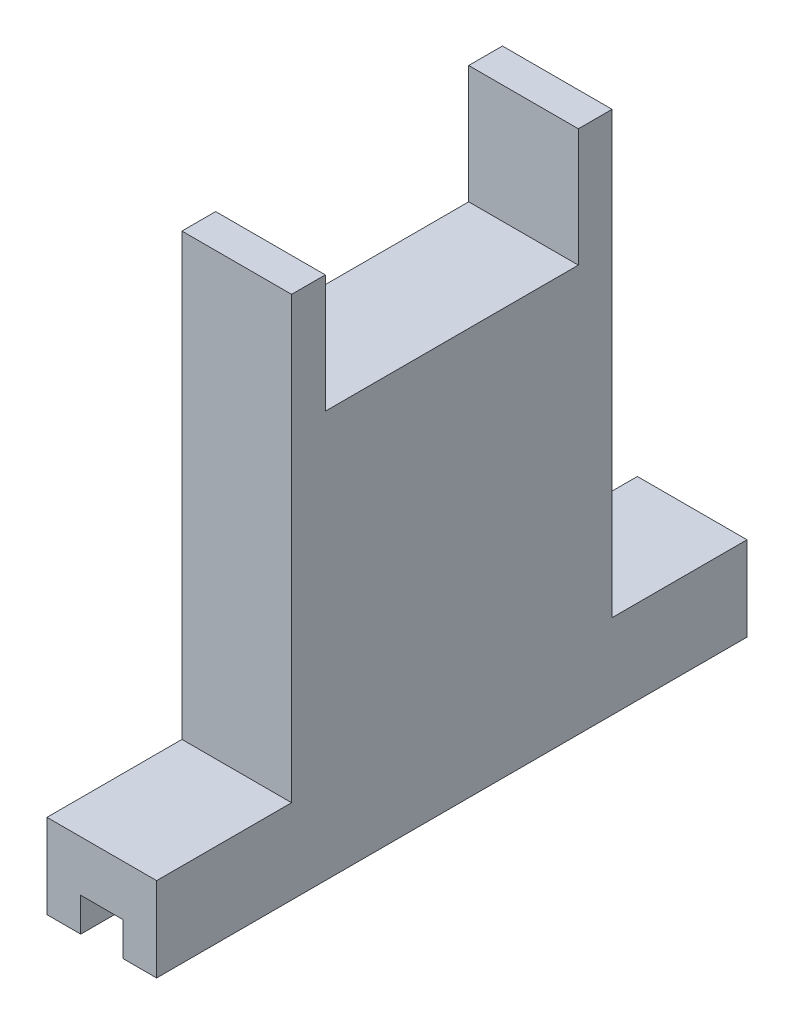
ISO-10303-21;
HEADER;
FILE_DESCRIPTION(('STEP AP214'),'2;1');
FILE_NAME('part.step','',(''),(''),'','','');
FILE_SCHEMA(('AUTOMOTIVE_DESIGN { 1 0 10303 214 1 1 1 1 }'));
ENDSEC;
DATA;
#1=APPLICATION_CONTEXT('core data for automotive mechanical design processes');
#2=APPLICATION_PROTOCOL_DEFINITION('international standard','automotive_design',2000,#1);
#3=PRODUCT_CONTEXT('',#1,'mechanical');
#4=PRODUCT('Part','Part','',(#3));
#5=PRODUCT_RELATED_PRODUCT_CATEGORY('part','',(#4));
#6=PRODUCT_DEFINITION_FORMATION('','',#4);
#7=PRODUCT_DEFINITION_CONTEXT('part definition',#1,'design');
#8=PRODUCT_DEFINITION('design','',#6,#7);
#9=PRODUCT_DEFINITION_SHAPE('','',#8);
#10=(LENGTH_UNIT() NAMED_UNIT(*) SI_UNIT(.MILLI.,.METRE.));
#11=(NAMED_UNIT(*) PLANE_ANGLE_UNIT() SI_UNIT($,.RADIAN.));
#12=(NAMED_UNIT(*) SI_UNIT($,.STERADIAN.) SOLID_ANGLE_UNIT());
#13=UNCERTAINTY_MEASURE_WITH_UNIT(LENGTH_MEASURE(1.E-05),#10,'distance_accuracy_value','');
#14=(GEOMETRIC_REPRESENTATION_CONTEXT(3) GLOBAL_UNCERTAINTY_ASSIGNED_CONTEXT((#13)) GLOBAL_UNIT_ASSIGNED_CONTEXT((#10,
#11,#12)) REPRESENTATION_CONTEXT('',''));
#15=CARTESIAN_POINT('',(0.,0.,0.));
#16=DIRECTION('',(0.,0.,1.));
#17=DIRECTION('',(1.,0.,0.));
#18=AXIS2_PLACEMENT_3D('',#15,#16,#17);
#19=CARTESIAN_POINT('',(0.,31.1,0.));
#20=DIRECTION('',(0.,1.,0.));
#21=DIRECTION('',(0.,0.,1.));
#22=AXIS2_PLACEMENT_3D('',#19,#20,#21);
#23=PLANE('',#22);
#24=DIRECTION('',(1.,0.,0.));
#25=VECTOR('',#24,1.);
#26=CARTESIAN_POINT('',(-83.4178979164732,31.1,-14.0159846434839));
#27=LINE('',#26,#25);
#28=CARTESIAN_POINT('',(-89.9178979164732,31.1,-14.0159846434839));
#29=VERTEX_POINT('',#28);
#30=CARTESIAN_POINT('',(-83.4178979164732,31.1,-14.0159846434839));
#31=VERTEX_POINT('',#30);
#32=EDGE_CURVE('E163',#29,#31,#27,.T.);
#33=ORIENTED_EDGE('',*,*,#32,.F.);
#34=DIRECTION('',(0.,0.,1.));
#35=VECTOR('',#34,1.);
#36=CARTESIAN_POINT('',(-89.9178979164732,31.1,-31.0159846434839));
#37=LINE('',#36,#35);
#38=CARTESIAN_POINT('',(-89.9178979164732,31.1,-12.0159846434839));
#39=VERTEX_POINT('',#38);
#40=EDGE_CURVE('E179',#29,#39,#37,.T.);
#41=ORIENTED_EDGE('',*,*,#40,.T.);
#42=DIRECTION('',(1.,0.,0.));
#43=VECTOR('',#42,1.);
#44=CARTESIAN_POINT('',(-89.9178979164732,31.1,-12.0159846434839));
#45=LINE('',#44,#43);
#46=CARTESIAN_POINT('',(-83.4178979164732,31.1,-12.0159846434839));
#47=VERTEX_POINT('',#46);
#48=EDGE_CURVE('E178',#39,#47,#45,.T.);
#49=ORIENTED_EDGE('',*,*,#48,.T.);
#50=DIRECTION('',(0.,0.,-1.));
#51=VECTOR('',#50,1.);
#52=CARTESIAN_POINT('',(-83.4178979164732,31.1,-31.0159846434839));
#53=LINE('',#52,#51);
#54=EDGE_CURVE('E181',#47,#31,#53,.T.);
#55=ORIENTED_EDGE('',*,*,#54,.T.);
#56=EDGE_LOOP('',(#33,#41,#49,#55));
#57=FACE_BOUND('',#56,.T.);
#58=ADVANCED_FACE('F35',(#57),#23,.T.);
#59=CARTESIAN_POINT('',(0.,5.,0.));
#60=DIRECTION('',(0.,1.,0.));
#61=DIRECTION('',(0.,0.,1.));
#62=AXIS2_PLACEMENT_3D('',#59,#60,#61);
#63=PLANE('',#62);
#64=DIRECTION('',(-1.,0.,0.));
#65=VECTOR('',#64,1.);
#66=CARTESIAN_POINT('',(-89.9178979164732,5.,-31.0159846434839));
#67=LINE('',#66,#65);
#68=CARTESIAN_POINT('',(-83.4178979164732,5.,-31.0159846434839));
#69=VERTEX_POINT('',#68);
#70=CARTESIAN_POINT('',(-89.9178979164732,5.,-31.0159846434839));
#71=VERTEX_POINT('',#70);
#72=EDGE_CURVE('E58',#69,#71,#67,.T.);
#73=ORIENTED_EDGE('',*,*,#72,.F.);
#74=DIRECTION('',(0.,0.,-1.));
#75=VECTOR('',#74,1.);
#76=CARTESIAN_POINT('',(-83.4178979164732,5.,-39.0159846434839));
#77=LINE('',#76,#75);
#78=CARTESIAN_POINT('',(-83.4178979164732,5.,-39.0159846434839));
#79=VERTEX_POINT('',#78);
#80=EDGE_CURVE('E227',#69,#79,#77,.T.);
#81=ORIENTED_EDGE('',*,*,#80,.T.);
#82=DIRECTION('',(-1.,0.,0.));
#83=VECTOR('',#82,1.);
#84=CARTESIAN_POINT('',(-89.9178979164732,5.,-39.0159846434839));
#85=LINE('',#84,#83);
#86=CARTESIAN_POINT('',(-89.9178979164732,5.,-39.0159846434839));
#87=VERTEX_POINT('',#86);
#88=EDGE_CURVE('E230',#79,#87,#85,.T.);
#89=ORIENTED_EDGE('',*,*,#88,.T.);
#90=DIRECTION('',(0.,0.,1.));
#91=VECTOR('',#90,1.);
#92=CARTESIAN_POINT('',(-89.9178979164732,5.,-39.0159846434839));
#93=LINE('',#92,#91);
#94=EDGE_CURVE('E222',#87,#71,#93,.T.);
#95=ORIENTED_EDGE('',*,*,#94,.T.);
#96=EDGE_LOOP('',(#73,#81,#89,#95));
#97=FACE_BOUND('',#96,.T.);
#98=ADVANCED_FACE('F295',(#97),#63,.T.);
#99=CARTESIAN_POINT('',(0.,0.,0.));
#100=DIRECTION('',(0.,1.,0.));
#101=DIRECTION('',(0.,0.,1.));
#102=AXIS2_PLACEMENT_3D('',#99,#100,#101);
#103=PLANE('',#102);
#104=DIRECTION('',(1.,0.,0.));
#105=VECTOR('',#104,1.);
#106=CARTESIAN_POINT('',(-89.9178979164732,0.,-4.01598464348394));
#107=LINE('',#106,#105);
#108=CARTESIAN_POINT('',(-85.4178979164732,0.,-4.01598464348394));
#109=VERTEX_POINT('',#108);
#110=CARTESIAN_POINT('',(-83.4178979164732,0.,-4.01598464348394));
#111=VERTEX_POINT('',#110);
#112=EDGE_CURVE('E235',#109,#111,#107,.T.);
#113=ORIENTED_EDGE('',*,*,#112,.F.);
#114=DIRECTION('',(0.,0.,-1.));
#115=VECTOR('',#114,1.);
#116=CARTESIAN_POINT('',(-85.4178979164732,0.,0.));
#117=LINE('',#116,#115);
#118=CARTESIAN_POINT('',(-85.4178979164732,0.,-39.0159846434839));
#119=VERTEX_POINT('',#118);
#120=EDGE_CURVE('E43',#109,#119,#117,.T.);
#121=ORIENTED_EDGE('',*,*,#120,.T.);
#122=DIRECTION('',(-1.,0.,0.));
#123=VECTOR('',#122,1.);
#124=CARTESIAN_POINT('',(-89.9178979164732,0.,-39.0159846434839));
#125=LINE('',#124,#123);
#126=CARTESIAN_POINT('',(-83.4178979164732,0.,-39.0159846434839));
#127=VERTEX_POINT('',#126);
#128=EDGE_CURVE('E242',#127,#119,#125,.T.);
#129=ORIENTED_EDGE('',*,*,#128,.F.);
#130=DIRECTION('',(0.,0.,-1.));
#131=VECTOR('',#130,1.);
#132=CARTESIAN_POINT('',(-83.4178979164732,0.,-39.0159846434839));
#133=LINE('',#132,#131);
#134=EDGE_CURVE('E239',#111,#127,#133,.T.);
#135=ORIENTED_EDGE('',*,*,#134,.F.);
#136=EDGE_LOOP('',(#113,#121,#129,#135));
#137=FACE_BOUND('',#136,.T.);
#138=ADVANCED_FACE('F262',(#137),#103,.F.);
#139=CARTESIAN_POINT('',(-89.9178979164732,5.,-39.0159846434839));
#140=DIRECTION('',(1.,0.,0.));
#141=DIRECTION('',(0.,0.,-1.));
#142=AXIS2_PLACEMENT_3D('',#139,#140,#141);
#143=PLANE('',#142);
#144=ORIENTED_EDGE('',*,*,#40,.F.);
#145=DIRECTION('',(0.,1.,0.));
#146=VECTOR('',#145,1.);
#147=CARTESIAN_POINT('',(-89.9178979164732,24.1,-14.0159846434839));
#148=LINE('',#147,#146);
#149=CARTESIAN_POINT('',(-89.9178979164732,24.1,-14.0159846434839));
#150=VERTEX_POINT('',#149);
#151=EDGE_CURVE('E170',#150,#29,#148,.T.);
#152=ORIENTED_EDGE('',*,*,#151,.F.);
#153=DIRECTION('',(0.,0.,1.));
#154=VECTOR('',#153,1.);
#155=CARTESIAN_POINT('',(-89.9178979164732,24.1,-29.0159846434839));
#156=LINE('',#155,#154);
#157=CARTESIAN_POINT('',(-89.9178979164732,24.1,-29.0159846434839));
#158=VERTEX_POINT('',#157);
#159=EDGE_CURVE('E153',#158,#150,#156,.T.);
#160=ORIENTED_EDGE('',*,*,#159,.F.);
#161=DIRECTION('',(0.,1.,0.));
#162=VECTOR('',#161,1.);
#163=CARTESIAN_POINT('',(-89.9178979164732,24.1,-29.0159846434839));
#164=LINE('',#163,#162);
#165=CARTESIAN_POINT('',(-89.9178979164732,31.1,-29.0159846434839));
#166=VERTEX_POINT('',#165);
#167=EDGE_CURVE('E150',#158,#166,#164,.T.);
#168=ORIENTED_EDGE('',*,*,#167,.T.);
#169=CARTESIAN_POINT('',(-89.9178979164732,31.1,-31.0159846434839));
#170=VERTEX_POINT('',#169);
#171=EDGE_CURVE('E175',#170,#166,#37,.T.);
#172=ORIENTED_EDGE('',*,*,#171,.F.);
#173=DIRECTION('',(0.,-1.,0.));
#174=VECTOR('',#173,1.);
#175=CARTESIAN_POINT('',(-89.9178979164732,31.1,-31.0159846434839));
#176=LINE('',#175,#174);
#177=EDGE_CURVE('E186',#170,#71,#176,.T.);
#178=ORIENTED_EDGE('',*,*,#177,.T.);
#179=ORIENTED_EDGE('',*,*,#94,.F.);
#180=DIRECTION('',(0.,-1.,0.));
#181=VECTOR('',#180,1.);
#182=CARTESIAN_POINT('',(-89.9178979164732,5.,-39.0159846434839));
#183=LINE('',#182,#181);
#184=CARTESIAN_POINT('',(-89.9178979164732,0.,-39.0159846434839));
#185=VERTEX_POINT('',#184);
#186=EDGE_CURVE('E232',#87,#185,#183,.T.);
#187=ORIENTED_EDGE('',*,*,#186,.T.);
#188=DIRECTION('',(0.,0.,1.));
#189=VECTOR('',#188,1.);
#190=CARTESIAN_POINT('',(-89.9178979164732,0.,-39.0159846434839));
#191=LINE('',#190,#189);
#192=CARTESIAN_POINT('',(-89.9178979164732,0.,-4.01598464348394));
#193=VERTEX_POINT('',#192);
#194=EDGE_CURVE('E221',#185,#193,#191,.T.);
#195=ORIENTED_EDGE('',*,*,#194,.T.);
#196=DIRECTION('',(0.,-1.,0.));
#197=VECTOR('',#196,1.);
#198=CARTESIAN_POINT('',(-89.9178979164732,5.,-4.01598464348394));
#199=LINE('',#198,#197);
#200=CARTESIAN_POINT('',(-89.9178979164732,5.,-4.01598464348394));
#201=VERTEX_POINT('',#200);
#202=EDGE_CURVE('E253',#201,#193,#199,.T.);
#203=ORIENTED_EDGE('',*,*,#202,.F.);
#204=CARTESIAN_POINT('',(-89.9178979164732,5.,-12.0159846434839));
#205=VERTEX_POINT('',#204);
#206=EDGE_CURVE('E225',#205,#201,#93,.T.);
#207=ORIENTED_EDGE('',*,*,#206,.F.);
#208=DIRECTION('',(0.,-1.,0.));
#209=VECTOR('',#208,1.);
#210=CARTESIAN_POINT('',(-89.9178979164732,31.1,-12.0159846434839));
#211=LINE('',#210,#209);
#212=EDGE_CURVE('E200',#39,#205,#211,.T.);
#213=ORIENTED_EDGE('',*,*,#212,.F.);
#214=EDGE_LOOP('',(#144,#152,#160,#168,#172,#178,#179,#187,#195,#203,#207,#213));
#215=FACE_BOUND('',#214,.T.);
#216=ADVANCED_FACE('F37',(#215),#143,.F.);
#217=CARTESIAN_POINT('',(-89.9178979164732,5.,-4.01598464348394));
#218=DIRECTION('',(0.,0.,-1.));
#219=DIRECTION('',(-1.,0.,0.));
#220=AXIS2_PLACEMENT_3D('',#217,#218,#219);
#221=PLANE('',#220);
#222=DIRECTION('',(-1.,0.,0.));
#223=VECTOR('',#222,1.);
#224=CARTESIAN_POINT('',(-85.4178979164732,2.,-4.01598464348394));
#225=LINE('',#224,#223);
#226=CARTESIAN_POINT('',(-85.4178979164732,2.,-4.01598464348394));
#227=VERTEX_POINT('',#226);
#228=CARTESIAN_POINT('',(-87.9178979164732,2.,-4.01598464348394));
#229=VERTEX_POINT('',#228);
#230=EDGE_CURVE('E206',#227,#229,#225,.T.);
#231=ORIENTED_EDGE('',*,*,#230,.F.);
#232=DIRECTION('',(0.,1.,0.));
#233=VECTOR('',#232,1.);
#234=CARTESIAN_POINT('',(-85.4178979164732,0.,-4.01598464348394));
#235=LINE('',#234,#233);
#236=EDGE_CURVE('E203',#109,#227,#235,.T.);
#237=ORIENTED_EDGE('',*,*,#236,.F.);
#238=ORIENTED_EDGE('',*,*,#112,.T.);
#239=DIRECTION('',(0.,-1.,0.));
#240=VECTOR('',#239,1.);
#241=CARTESIAN_POINT('',(-83.4178979164732,5.,-4.01598464348394));
#242=LINE('',#241,#240);
#243=CARTESIAN_POINT('',(-83.4178979164732,5.,-4.01598464348394));
#244=VERTEX_POINT('',#243);
#245=EDGE_CURVE('E250',#244,#111,#242,.T.);
#246=ORIENTED_EDGE('',*,*,#245,.F.);
#247=DIRECTION('',(1.,0.,0.));
#248=VECTOR('',#247,1.);
#249=CARTESIAN_POINT('',(-89.9178979164732,5.,-4.01598464348394));
#250=LINE('',#249,#248);
#251=EDGE_CURVE('E224',#201,#244,#250,.T.);
#252=ORIENTED_EDGE('',*,*,#251,.F.);
#253=ORIENTED_EDGE('',*,*,#202,.T.);
#254=CARTESIAN_POINT('',(-87.9178979164732,0.,-4.01598464348394));
#255=VERTEX_POINT('',#254);
#256=EDGE_CURVE('E236',#193,#255,#107,.T.);
#257=ORIENTED_EDGE('',*,*,#256,.T.);
#258=DIRECTION('',(0.,-1.,0.));
#259=VECTOR('',#258,1.);
#260=CARTESIAN_POINT('',(-87.9178979164732,0.,-4.01598464348394));
#261=LINE('',#260,#259);
#262=EDGE_CURVE('E209',#229,#255,#261,.T.);
#263=ORIENTED_EDGE('',*,*,#262,.F.);
#264=EDGE_LOOP('',(#231,#237,#238,#246,#252,#253,#257,#263));
#265=FACE_BOUND('',#264,.T.);
#266=ADVANCED_FACE('F276',(#265),#221,.F.);
#267=CARTESIAN_POINT('',(-83.4178979164732,5.,-39.0159846434839));
#268=DIRECTION('',(-1.,0.,0.));
#269=DIRECTION('',(0.,0.,1.));
#270=AXIS2_PLACEMENT_3D('',#267,#268,#269);
#271=PLANE('',#270);
#272=DIRECTION('',(0.,0.,-1.));
#273=VECTOR('',#272,1.);
#274=CARTESIAN_POINT('',(-83.4178979164732,24.1,-29.0159846434839));
#275=LINE('',#274,#273);
#276=CARTESIAN_POINT('',(-83.4178979164732,24.1,-14.0159846434839));
#277=VERTEX_POINT('',#276);
#278=CARTESIAN_POINT('',(-83.4178979164732,24.1,-29.0159846434839));
#279=VERTEX_POINT('',#278);
#280=EDGE_CURVE('E154',#277,#279,#275,.T.);
#281=ORIENTED_EDGE('',*,*,#280,.F.);
#282=DIRECTION('',(0.,1.,0.));
#283=VECTOR('',#282,1.);
#284=CARTESIAN_POINT('',(-83.4178979164732,24.1,-14.0159846434839));
#285=LINE('',#284,#283);
#286=EDGE_CURVE('E190',#277,#31,#285,.T.);
#287=ORIENTED_EDGE('',*,*,#286,.T.);
#288=ORIENTED_EDGE('',*,*,#54,.F.);
#289=DIRECTION('',(0.,-1.,0.));
#290=VECTOR('',#289,1.);
#291=CARTESIAN_POINT('',(-83.4178979164732,31.1,-12.0159846434839));
#292=LINE('',#291,#290);
#293=CARTESIAN_POINT('',(-83.4178979164732,5.,-12.0159846434839));
#294=VERTEX_POINT('',#293);
#295=EDGE_CURVE('E197',#47,#294,#292,.T.);
#296=ORIENTED_EDGE('',*,*,#295,.T.);
#297=EDGE_CURVE('E228',#244,#294,#77,.T.);
#298=ORIENTED_EDGE('',*,*,#297,.F.);
#299=ORIENTED_EDGE('',*,*,#245,.T.);
#300=ORIENTED_EDGE('',*,*,#134,.T.);
#301=DIRECTION('',(0.,-1.,0.));
#302=VECTOR('',#301,1.);
#303=CARTESIAN_POINT('',(-83.4178979164732,5.,-39.0159846434839));
#304=LINE('',#303,#302);
#305=EDGE_CURVE('E247',#79,#127,#304,.T.);
#306=ORIENTED_EDGE('',*,*,#305,.F.);
#307=ORIENTED_EDGE('',*,*,#80,.F.);
#308=DIRECTION('',(0.,-1.,0.));
#309=VECTOR('',#308,1.);
#310=CARTESIAN_POINT('',(-83.4178979164732,31.1,-31.0159846434839));
#311=LINE('',#310,#309);
#312=CARTESIAN_POINT('',(-83.4178979164732,31.1,-31.0159846434839));
#313=VERTEX_POINT('',#312);
#314=EDGE_CURVE('E194',#313,#69,#311,.T.);
#315=ORIENTED_EDGE('',*,*,#314,.F.);
#316=CARTESIAN_POINT('',(-83.4178979164732,31.1,-29.0159846434839));
#317=VERTEX_POINT('',#316);
#318=EDGE_CURVE('E168',#317,#313,#53,.T.);
#319=ORIENTED_EDGE('',*,*,#318,.F.);
#320=DIRECTION('',(0.,1.,0.));
#321=VECTOR('',#320,1.);
#322=CARTESIAN_POINT('',(-83.4178979164732,24.1,-29.0159846434839));
#323=LINE('',#322,#321);
#324=EDGE_CURVE('E50',#279,#317,#323,.T.);
#325=ORIENTED_EDGE('',*,*,#324,.F.);
#326=EDGE_LOOP('',(#281,#287,#288,#296,#298,#299,#300,#306,#307,#315,#319,#325));
#327=FACE_BOUND('',#326,.T.);
#328=ADVANCED_FACE('F166',(#327),#271,.F.);
#329=CARTESIAN_POINT('',(-89.9178979164732,5.,-39.0159846434839));
#330=DIRECTION('',(0.,0.,1.));
#331=DIRECTION('',(1.,0.,0.));
#332=AXIS2_PLACEMENT_3D('',#329,#330,#331);
#333=PLANE('',#332);
#334=ORIENTED_EDGE('',*,*,#128,.T.);
#335=DIRECTION('',(0.,1.,0.));
#336=VECTOR('',#335,1.);
#337=CARTESIAN_POINT('',(-85.4178979164732,5.,-39.0159846434839));
#338=LINE('',#337,#336);
#339=CARTESIAN_POINT('',(-85.4178979164732,2.,-39.0159846434839));
#340=VERTEX_POINT('',#339);
#341=EDGE_CURVE('E218',#119,#340,#338,.T.);
#342=ORIENTED_EDGE('',*,*,#341,.T.);
#343=DIRECTION('',(-1.,0.,0.));
#344=VECTOR('',#343,1.);
#345=CARTESIAN_POINT('',(-89.9178979164732,2.,-39.0159846434839));
#346=LINE('',#345,#344);
#347=CARTESIAN_POINT('',(-87.9178979164732,2.,-39.0159846434839));
#348=VERTEX_POINT('',#347);
#349=EDGE_CURVE('E11',#340,#348,#346,.T.);
#350=ORIENTED_EDGE('',*,*,#349,.T.);
#351=DIRECTION('',(0.,-1.,0.));
#352=VECTOR('',#351,1.);
#353=CARTESIAN_POINT('',(-87.9178979164732,5.,-39.0159846434839));
#354=LINE('',#353,#352);
#355=CARTESIAN_POINT('',(-87.9178979164732,0.,-39.0159846434839));
#356=VERTEX_POINT('',#355);
#357=EDGE_CURVE('E214',#348,#356,#354,.T.);
#358=ORIENTED_EDGE('',*,*,#357,.T.);
#359=EDGE_CURVE('E241',#356,#185,#125,.T.);
#360=ORIENTED_EDGE('',*,*,#359,.T.);
#361=ORIENTED_EDGE('',*,*,#186,.F.);
#362=ORIENTED_EDGE('',*,*,#88,.F.);
#363=ORIENTED_EDGE('',*,*,#305,.T.);
#364=EDGE_LOOP('',(#334,#342,#350,#358,#360,#361,#362,#363));
#365=FACE_BOUND('',#364,.T.);
#366=ADVANCED_FACE('F267',(#365),#333,.F.);
#367=DIRECTION('',(1.,0.,0.));
#368=VECTOR('',#367,1.);
#369=CARTESIAN_POINT('',(-89.9178979164732,5.,-12.0159846434839));
#370=LINE('',#369,#368);
#371=EDGE_CURVE('E187',#205,#294,#370,.T.);
#372=ORIENTED_EDGE('',*,*,#371,.F.);
#373=ORIENTED_EDGE('',*,*,#206,.T.);
#374=ORIENTED_EDGE('',*,*,#251,.T.);
#375=ORIENTED_EDGE('',*,*,#297,.T.);
#376=EDGE_LOOP('',(#372,#373,#374,#375));
#377=FACE_BOUND('',#376,.T.);
#378=ADVANCED_FACE('F318',(#377),#63,.T.);
#379=ORIENTED_EDGE('',*,*,#359,.F.);
#380=DIRECTION('',(0.,0.,1.));
#381=VECTOR('',#380,1.);
#382=CARTESIAN_POINT('',(-87.9178979164732,0.,0.));
#383=LINE('',#382,#381);
#384=EDGE_CURVE('E256',#356,#255,#383,.T.);
#385=ORIENTED_EDGE('',*,*,#384,.T.);
#386=ORIENTED_EDGE('',*,*,#256,.F.);
#387=ORIENTED_EDGE('',*,*,#194,.F.);
#388=EDGE_LOOP('',(#379,#385,#386,#387));
#389=FACE_BOUND('',#388,.T.);
#390=ADVANCED_FACE('F288',(#389),#103,.F.);
#391=CARTESIAN_POINT('',(-85.4178979164732,2.,-184.015984643484));
#392=DIRECTION('',(0.,1.,0.));
#393=DIRECTION('',(-1.,0.,0.));
#394=AXIS2_PLACEMENT_3D('',#391,#392,#393);
#395=PLANE('',#394);
#396=DIRECTION('',(0.,0.,1.));
#397=VECTOR('',#396,1.);
#398=CARTESIAN_POINT('',(-85.4178979164732,2.,-184.015984643484));
#399=LINE('',#398,#397);
#400=EDGE_CURVE('E211',#340,#227,#399,.T.);
#401=ORIENTED_EDGE('',*,*,#400,.T.);
#402=ORIENTED_EDGE('',*,*,#230,.T.);
#403=DIRECTION('',(0.,0.,1.));
#404=VECTOR('',#403,1.);
#405=CARTESIAN_POINT('',(-87.9178979164732,2.,-184.015984643484));
#406=LINE('',#405,#404);
#407=EDGE_CURVE('E212',#348,#229,#406,.T.);
#408=ORIENTED_EDGE('',*,*,#407,.F.);
#409=ORIENTED_EDGE('',*,*,#349,.F.);
#410=EDGE_LOOP('',(#401,#402,#408,#409));
#411=FACE_BOUND('',#410,.T.);
#412=ADVANCED_FACE('F282',(#411),#395,.F.);
#413=CARTESIAN_POINT('',(-85.4178979164732,0.,-184.015984643484));
#414=DIRECTION('',(1.,0.,0.));
#415=DIRECTION('',(0.,0.,-1.));
#416=AXIS2_PLACEMENT_3D('',#413,#414,#415);
#417=PLANE('',#416);
#418=ORIENTED_EDGE('',*,*,#120,.F.);
#419=ORIENTED_EDGE('',*,*,#236,.T.);
#420=ORIENTED_EDGE('',*,*,#400,.F.);
#421=ORIENTED_EDGE('',*,*,#341,.F.);
#422=EDGE_LOOP('',(#418,#419,#420,#421));
#423=FACE_BOUND('',#422,.T.);
#424=ADVANCED_FACE('F280',(#423),#417,.F.);
#425=CARTESIAN_POINT('',(-87.9178979164732,0.,-184.015984643484));
#426=DIRECTION('',(-1.,0.,0.));
#427=DIRECTION('',(0.,0.,1.));
#428=AXIS2_PLACEMENT_3D('',#425,#426,#427);
#429=PLANE('',#428);
#430=ORIENTED_EDGE('',*,*,#407,.T.);
#431=ORIENTED_EDGE('',*,*,#262,.T.);
#432=ORIENTED_EDGE('',*,*,#384,.F.);
#433=ORIENTED_EDGE('',*,*,#357,.F.);
#434=EDGE_LOOP('',(#430,#431,#432,#433));
#435=FACE_BOUND('',#434,.T.);
#436=ADVANCED_FACE('F344',(#435),#429,.F.);
#437=CARTESIAN_POINT('',(-89.9178979164732,31.1,-12.0159846434839));
#438=DIRECTION('',(0.,0.,-1.));
#439=DIRECTION('',(-1.,0.,0.));
#440=AXIS2_PLACEMENT_3D('',#437,#438,#439);
#441=PLANE('',#440);
#442=ORIENTED_EDGE('',*,*,#371,.T.);
#443=ORIENTED_EDGE('',*,*,#295,.F.);
#444=ORIENTED_EDGE('',*,*,#48,.F.);
#445=ORIENTED_EDGE('',*,*,#212,.T.);
#446=EDGE_LOOP('',(#442,#443,#444,#445));
#447=FACE_BOUND('',#446,.T.);
#448=ADVANCED_FACE('F315',(#447),#441,.F.);
#449=CARTESIAN_POINT('',(-89.9178979164732,31.1,-31.0159846434839));
#450=DIRECTION('',(0.,0.,1.));
#451=DIRECTION('',(1.,0.,0.));
#452=AXIS2_PLACEMENT_3D('',#449,#450,#451);
#453=PLANE('',#452);
#454=ORIENTED_EDGE('',*,*,#72,.T.);
#455=ORIENTED_EDGE('',*,*,#177,.F.);
#456=DIRECTION('',(-1.,0.,0.));
#457=VECTOR('',#456,1.);
#458=CARTESIAN_POINT('',(-89.9178979164732,31.1,-31.0159846434839));
#459=LINE('',#458,#457);
#460=EDGE_CURVE('E184',#313,#170,#459,.T.);
#461=ORIENTED_EDGE('',*,*,#460,.F.);
#462=ORIENTED_EDGE('',*,*,#314,.T.);
#463=EDGE_LOOP('',(#454,#455,#461,#462));
#464=FACE_BOUND('',#463,.T.);
#465=ADVANCED_FACE('F297',(#464),#453,.F.);
#466=DIRECTION('',(-1.,0.,0.));
#467=VECTOR('',#466,1.);
#468=CARTESIAN_POINT('',(-83.4178979164732,31.1,-29.0159846434839));
#469=LINE('',#468,#467);
#470=EDGE_CURVE('E301',#317,#166,#469,.T.);
#471=ORIENTED_EDGE('',*,*,#470,.F.);
#472=ORIENTED_EDGE('',*,*,#318,.T.);
#473=ORIENTED_EDGE('',*,*,#460,.T.);
#474=ORIENTED_EDGE('',*,*,#171,.T.);
#475=EDGE_LOOP('',(#471,#472,#473,#474));
#476=FACE_BOUND('',#475,.T.);
#477=ADVANCED_FACE('F300',(#476),#23,.T.);
#478=CARTESIAN_POINT('',(-83.4178979164732,24.1,-14.0159846434839));
#479=DIRECTION('',(0.,0.,1.));
#480=DIRECTION('',(1.,0.,0.));
#481=AXIS2_PLACEMENT_3D('',#478,#479,#480);
#482=PLANE('',#481);
#483=ORIENTED_EDGE('',*,*,#32,.T.);
#484=ORIENTED_EDGE('',*,*,#286,.F.);
#485=DIRECTION('',(1.,0.,0.));
#486=VECTOR('',#485,1.);
#487=CARTESIAN_POINT('',(-83.4178979164732,24.1,-14.0159846434839));
#488=LINE('',#487,#486);
#489=EDGE_CURVE('E160',#150,#277,#488,.T.);
#490=ORIENTED_EDGE('',*,*,#489,.F.);
#491=ORIENTED_EDGE('',*,*,#151,.T.);
#492=EDGE_LOOP('',(#483,#484,#490,#491));
#493=FACE_BOUND('',#492,.T.);
#494=ADVANCED_FACE('F309',(#493),#482,.F.);
#495=CARTESIAN_POINT('',(-83.4178979164732,24.1,-29.0159846434839));
#496=DIRECTION('',(0.,0.,-1.));
#497=DIRECTION('',(-1.,0.,0.));
#498=AXIS2_PLACEMENT_3D('',#495,#496,#497);
#499=PLANE('',#498);
#500=ORIENTED_EDGE('',*,*,#470,.T.);
#501=ORIENTED_EDGE('',*,*,#167,.F.);
#502=DIRECTION('',(-1.,0.,0.));
#503=VECTOR('',#502,1.);
#504=CARTESIAN_POINT('',(-83.4178979164732,24.1,-29.0159846434839));
#505=LINE('',#504,#503);
#506=EDGE_CURVE('E146',#279,#158,#505,.T.);
#507=ORIENTED_EDGE('',*,*,#506,.F.);
#508=ORIENTED_EDGE('',*,*,#324,.T.);
#509=EDGE_LOOP('',(#500,#501,#507,#508));
#510=FACE_BOUND('',#509,.T.);
#511=ADVANCED_FACE('F148',(#510),#499,.F.);
#512=CARTESIAN_POINT('',(0.,24.1,0.));
#513=DIRECTION('',(0.,-1.,0.));
#514=DIRECTION('',(0.,0.,-1.));
#515=AXIS2_PLACEMENT_3D('',#512,#513,#514);
#516=PLANE('',#515);
#517=ORIENTED_EDGE('',*,*,#280,.T.);
#518=ORIENTED_EDGE('',*,*,#506,.T.);
#519=ORIENTED_EDGE('',*,*,#159,.T.);
#520=ORIENTED_EDGE('',*,*,#489,.T.);
#521=EDGE_LOOP('',(#517,#518,#519,#520));
#522=FACE_BOUND('',#521,.T.);
#523=ADVANCED_FACE('F158',(#522),#516,.F.);
#524=CLOSED_SHELL('',(#58,#98,#138,#216,#266,#328,#366,#378,#390,#412,#424,#436,#448,#465,#477,
#494,#511,#523));
#525=MANIFOLD_SOLID_BREP('B2',#524);
#526=ADVANCED_BREP_SHAPE_REPRESENTATION('',(#18,#525),#14);
#527=SHAPE_DEFINITION_REPRESENTATION(#9,#526);
ENDSEC;
END-ISO-10303-21;
